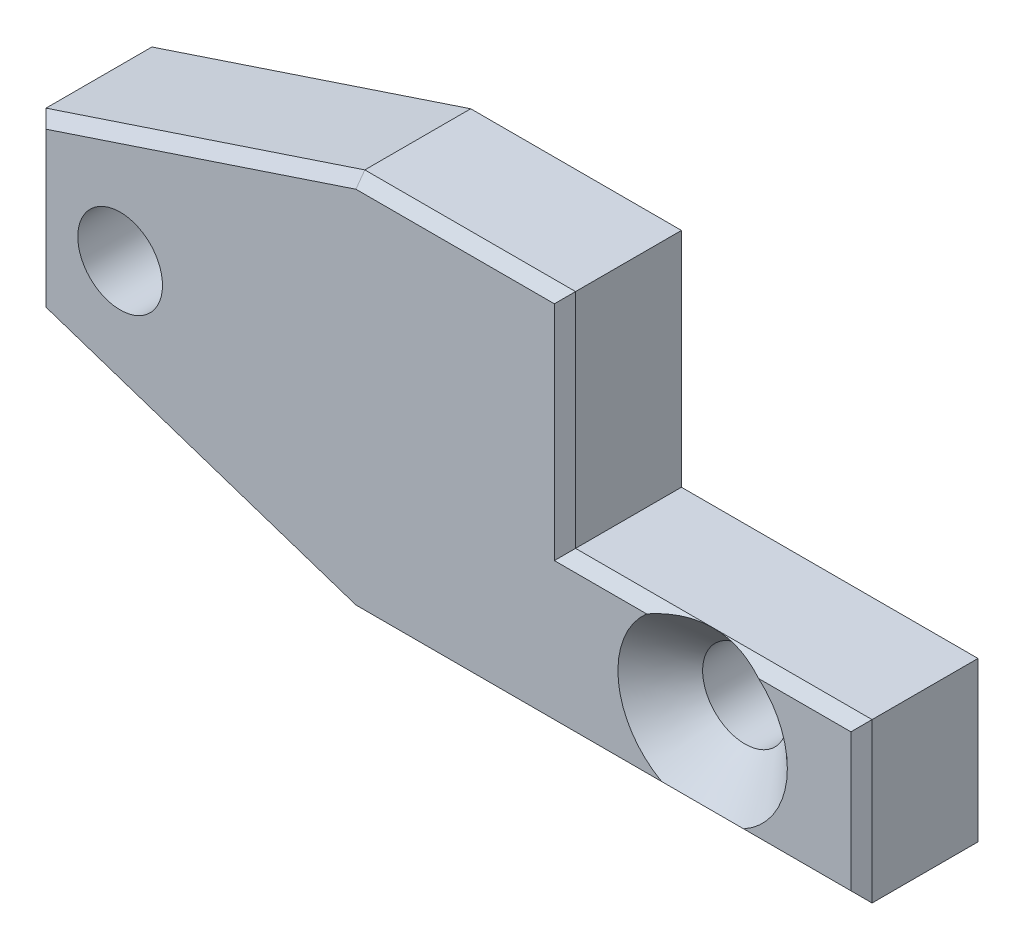
ISO-10303-21;
HEADER;
FILE_DESCRIPTION(('STEP AP214'),'2;1');
FILE_NAME('part.step','',(''),(''),'','','');
FILE_SCHEMA(('AUTOMOTIVE_DESIGN { 1 0 10303 214 1 1 1 1 }'));
ENDSEC;
DATA;
#1=APPLICATION_CONTEXT('core data for automotive mechanical design processes');
#2=APPLICATION_PROTOCOL_DEFINITION('international standard','automotive_design',2000,#1);
#3=PRODUCT_CONTEXT('',#1,'mechanical');
#4=PRODUCT('Part','Part','',(#3));
#5=PRODUCT_RELATED_PRODUCT_CATEGORY('part','',(#4));
#6=PRODUCT_DEFINITION_FORMATION('','',#4);
#7=PRODUCT_DEFINITION_CONTEXT('part definition',#1,'design');
#8=PRODUCT_DEFINITION('design','',#6,#7);
#9=PRODUCT_DEFINITION_SHAPE('','',#8);
#10=(LENGTH_UNIT() NAMED_UNIT(*) SI_UNIT(.MILLI.,.METRE.));
#11=(NAMED_UNIT(*) PLANE_ANGLE_UNIT() SI_UNIT($,.RADIAN.));
#12=(NAMED_UNIT(*) SI_UNIT($,.STERADIAN.) SOLID_ANGLE_UNIT());
#13=UNCERTAINTY_MEASURE_WITH_UNIT(LENGTH_MEASURE(1.E-05),#10,'distance_accuracy_value','');
#14=(GEOMETRIC_REPRESENTATION_CONTEXT(3) GLOBAL_UNCERTAINTY_ASSIGNED_CONTEXT((#13)) GLOBAL_UNIT_ASSIGNED_CONTEXT((#10,
#11,#12)) REPRESENTATION_CONTEXT('',''));
#15=CARTESIAN_POINT('',(0.,0.,0.));
#16=DIRECTION('',(0.,0.,1.));
#17=DIRECTION('',(1.,0.,0.));
#18=AXIS2_PLACEMENT_3D('',#15,#16,#17);
#19=CARTESIAN_POINT('',(0.,0.,5.49999999999999));
#20=DIRECTION('',(0.,-0.707106781186551,-0.707106781186544));
#21=DIRECTION('',(0.,0.707106781186544,-0.707106781186551));
#22=AXIS2_PLACEMENT_3D('',#19,#20,#21);
#23=PLANE('',#22);
#24=DIRECTION('',(-1.,0.,0.));
#25=VECTOR('',#24,1.);
#26=CARTESIAN_POINT('',(-25.,-0.500000000000004,6.));
#27=LINE('',#26,#25);
#28=CARTESIAN_POINT('',(3.8542486889354,-0.500000000000004,6.));
#29=VERTEX_POINT('',#28);
#30=CARTESIAN_POINT('',(-0.500000000000004,-0.500000000000004,6.));
#31=VERTEX_POINT('',#30);
#32=EDGE_CURVE('E267',#29,#31,#27,.T.);
#33=ORIENTED_EDGE('',*,*,#32,.F.);
#34=CARTESIAN_POINT('',(3.8542486889354,-0.500000000000004,6.));
#35=CARTESIAN_POINT('',(4.01258641155454,-0.440132190059061,5.94013219005906));
#36=CARTESIAN_POINT('',(4.17423871776889,-0.384426980618076,5.88442698061807));
#37=CARTESIAN_POINT('',(4.50389329499785,-0.282663844573456,5.78266384457345));
#38=CARTESIAN_POINT('',(4.6719083693802,-0.236626739217406,5.7366267392174));
#39=CARTESIAN_POINT('',(5.01238331410665,-0.15601328637291,5.6560132863729));
#40=CARTESIAN_POINT('',(5.18481341387426,-0.121374877028249,5.62137487702824));
#41=CARTESIAN_POINT('',(5.53361721308568,-0.0645379350736839,5.56453793507368));
#42=CARTESIAN_POINT('',(5.70998746513015,-0.0423289390717648,5.54232893907176));
#43=CARTESIAN_POINT('',(6.05237188354469,-0.0123708478117839,5.51237084781177));
#44=CARTESIAN_POINT('',(6.21822452461401,-0.00370115215090701,5.5037011521509));
#45=CARTESIAN_POINT('',(6.55036088112707,0.00178855513858064,5.49821144486141));
#46=CARTESIAN_POINT('',(6.71664467029121,-0.0013936144390148,5.50139361443901));
#47=CARTESIAN_POINT('',(7.0478905678525,-0.0194818903031596,5.51948189030315));
#48=CARTESIAN_POINT('',(7.21285285999822,-0.0343863370360475,5.53438633703604));
#49=CARTESIAN_POINT('',(7.53994163162591,-0.0753382533007976,5.57533825330079));
#50=CARTESIAN_POINT('',(7.70206865391248,-0.101383565088551,5.60138356508854));
#51=CARTESIAN_POINT('',(7.97376364951053,-0.154250209767276,5.65425020976727));
#52=CARTESIAN_POINT('',(8.0843760808811,-0.178446586628591,5.67844658662858));
#53=CARTESIAN_POINT('',(8.30341082275698,-0.231449845749152,5.73144984574915));
#54=CARTESIAN_POINT('',(8.41183240865257,-0.260258226176412,5.76025822617641));
#55=CARTESIAN_POINT('',(8.62603403044919,-0.322040536484198,5.82204053648419));
#56=CARTESIAN_POINT('',(8.73181845080289,-0.355006911149039,5.85500691114903));
#57=CARTESIAN_POINT('',(8.9407608145694,-0.424742981459738,5.92474298145973));
#58=CARTESIAN_POINT('',(9.0439205907956,-0.461509926933846,5.96150992693384));
#59=CARTESIAN_POINT('',(9.1457513110646,-0.500000000000004,6.));
#60=B_SPLINE_CURVE_WITH_KNOTS('',3,(#34,#35,#36,#37,#38,#39,#40,#41,#42,#43,#44,#45,#46,#47,#48,
#49,#50,#51,#52,#53,#54,#55,#56,#57,#58,#59),.UNSPECIFIED.,.F.,.F.,(4,2,2,2,2,2,2,2,2,2,2,2,4),
(0.,0.538753990696989,1.07865660690679,1.61556903971774,2.15202880367172,2.65011954996967,
3.14830196895251,3.64641387163051,4.144429344479,4.49158740829916,4.83885847298459,
5.18550738739084,5.53190719251239),.UNSPECIFIED.);
#61=CARTESIAN_POINT('',(6.5,0.,5.49999999999999));
#62=VERTEX_POINT('',#61);
#63=EDGE_CURVE('E11',#29,#62,#60,.T.);
#64=ORIENTED_EDGE('',*,*,#63,.T.);
#65=DIRECTION('',(1.,0.,0.));
#66=VECTOR('',#65,1.);
#67=CARTESIAN_POINT('',(0.,0.,5.49999999999999));
#68=LINE('',#67,#66);
#69=CARTESIAN_POINT('',(0.,0.,5.49999999999999));
#70=VERTEX_POINT('',#69);
#71=EDGE_CURVE('E240',#70,#62,#68,.T.);
#72=ORIENTED_EDGE('',*,*,#71,.F.);
#73=DIRECTION('',(-0.577350269189624,-0.577350269189624,0.57735026918963));
#74=VECTOR('',#73,1.);
#75=CARTESIAN_POINT('',(3.49999999999998,3.49999999999998,1.99999999999998));
#76=LINE('',#75,#74);
#77=EDGE_CURVE('E337',#31,#70,#76,.F.);
#78=ORIENTED_EDGE('',*,*,#77,.F.);
#79=EDGE_LOOP('',(#33,#64,#72,#78));
#80=FACE_BOUND('',#79,.T.);
#81=ADVANCED_FACE('F33',(#80),#23,.F.);
#82=CARTESIAN_POINT('',(-25.,10.5,6.));
#83=DIRECTION('',(0.,0.,1.));
#84=DIRECTION('',(1.,0.,0.));
#85=AXIS2_PLACEMENT_3D('',#82,#83,#84);
#86=PLANE('',#85);
#87=CARTESIAN_POINT('',(13.5,-0.500000000000004,6.));
#88=VERTEX_POINT('',#87);
#89=CARTESIAN_POINT('',(9.1457513110646,-0.500000000000004,6.));
#90=VERTEX_POINT('',#89);
#91=EDGE_CURVE('E268',#88,#90,#27,.T.);
#92=ORIENTED_EDGE('',*,*,#91,.T.);
#93=CARTESIAN_POINT('',(6.5,-3.50000000000001,6.));
#94=DIRECTION('',(0.,0.,1.));
#95=DIRECTION('',(1.,0.,0.));
#96=AXIS2_PLACEMENT_3D('',#93,#94,#95);
#97=CIRCLE('',#96,4.00000000000002);
#98=CARTESIAN_POINT('',(8.43649167310376,-7.,6.));
#99=VERTEX_POINT('',#98);
#100=EDGE_CURVE('E279',#90,#99,#97,.F.);
#101=ORIENTED_EDGE('',*,*,#100,.T.);
#102=DIRECTION('',(1.,0.,0.));
#103=VECTOR('',#102,1.);
#104=CARTESIAN_POINT('',(14.,-6.99999999999999,6.));
#105=LINE('',#104,#103);
#106=CARTESIAN_POINT('',(13.5,-6.99999999999999,6.));
#107=VERTEX_POINT('',#106);
#108=EDGE_CURVE('E261',#99,#107,#105,.T.);
#109=ORIENTED_EDGE('',*,*,#108,.T.);
#110=DIRECTION('',(0.,1.,0.));
#111=VECTOR('',#110,1.);
#112=CARTESIAN_POINT('',(13.5,10.5,6.));
#113=LINE('',#112,#111);
#114=EDGE_CURVE('E265',#107,#88,#113,.T.);
#115=ORIENTED_EDGE('',*,*,#114,.T.);
#116=EDGE_LOOP('',(#92,#101,#109,#115));
#117=FACE_BOUND('',#116,.T.);
#118=ADVANCED_FACE('F328',(#117),#86,.T.);
#119=CARTESIAN_POINT('',(0.,10.5,6.));
#120=DIRECTION('',(0.,-1.,0.));
#121=DIRECTION('',(0.,0.,-1.));
#122=AXIS2_PLACEMENT_3D('',#119,#120,#121);
#123=PLANE('',#122);
#124=DIRECTION('',(0.,0.,-1.));
#125=VECTOR('',#124,1.);
#126=CARTESIAN_POINT('',(0.,10.5,6.));
#127=LINE('',#126,#125);
#128=CARTESIAN_POINT('',(0.,10.5,5.5));
#129=VERTEX_POINT('',#128);
#130=CARTESIAN_POINT('',(0.,10.5,0.500000000000009));
#131=VERTEX_POINT('',#130);
#132=EDGE_CURVE('E384',#129,#131,#127,.T.);
#133=ORIENTED_EDGE('',*,*,#132,.T.);
#134=DIRECTION('',(-1.,0.,0.));
#135=VECTOR('',#134,1.);
#136=CARTESIAN_POINT('',(0.,10.5,0.500000000000009));
#137=LINE('',#136,#135);
#138=CARTESIAN_POINT('',(-9.94877148771488,10.5,0.500000000000008));
#139=VERTEX_POINT('',#138);
#140=EDGE_CURVE('E252',#131,#139,#137,.T.);
#141=ORIENTED_EDGE('',*,*,#140,.T.);
#142=DIRECTION('',(0.,0.,-1.));
#143=VECTOR('',#142,1.);
#144=CARTESIAN_POINT('',(-9.94877148771488,10.5,6.));
#145=LINE('',#144,#143);
#146=CARTESIAN_POINT('',(-9.94877148771488,10.5,5.5));
#147=VERTEX_POINT('',#146);
#148=EDGE_CURVE('E189',#147,#139,#145,.T.);
#149=ORIENTED_EDGE('',*,*,#148,.F.);
#150=DIRECTION('',(1.,0.,0.));
#151=VECTOR('',#150,1.);
#152=CARTESIAN_POINT('',(0.,10.5,5.5));
#153=LINE('',#152,#151);
#154=EDGE_CURVE('E250',#147,#129,#153,.T.);
#155=ORIENTED_EDGE('',*,*,#154,.T.);
#156=EDGE_LOOP('',(#133,#141,#149,#155));
#157=FACE_BOUND('',#156,.T.);
#158=ADVANCED_FACE('F332',(#157),#123,.F.);
#159=CARTESIAN_POINT('',(-9.94877148771488,10.5,6.));
#160=DIRECTION('',(0.315258587348597,-0.949005807728787,0.));
#161=DIRECTION('',(0.949005807728787,0.315258587348597,0.));
#162=AXIS2_PLACEMENT_3D('',#159,#160,#161);
#163=PLANE('',#162);
#164=ORIENTED_EDGE('',*,*,#148,.T.);
#165=DIRECTION('',(-0.949005807728787,-0.315258587348597,0.));
#166=VECTOR('',#165,1.);
#167=CARTESIAN_POINT('',(-9.94877148771488,10.5,0.500000000000009));
#168=LINE('',#167,#166);
#169=CARTESIAN_POINT('',(-25.,5.5,0.500000000000009));
#170=VERTEX_POINT('',#169);
#171=EDGE_CURVE('E188',#139,#170,#168,.T.);
#172=ORIENTED_EDGE('',*,*,#171,.T.);
#173=DIRECTION('',(0.,0.,-1.));
#174=VECTOR('',#173,1.);
#175=CARTESIAN_POINT('',(-25.,5.5,6.));
#176=LINE('',#175,#174);
#177=CARTESIAN_POINT('',(-25.,5.5,5.5));
#178=VERTEX_POINT('',#177);
#179=EDGE_CURVE('E171',#178,#170,#176,.T.);
#180=ORIENTED_EDGE('',*,*,#179,.F.);
#181=DIRECTION('',(0.949005807728787,0.315258587348597,0.));
#182=VECTOR('',#181,1.);
#183=CARTESIAN_POINT('',(-9.94877148771488,10.5,5.5));
#184=LINE('',#183,#182);
#185=EDGE_CURVE('E185',#178,#147,#184,.T.);
#186=ORIENTED_EDGE('',*,*,#185,.T.);
#187=EDGE_LOOP('',(#164,#172,#180,#186));
#188=FACE_BOUND('',#187,.T.);
#189=ADVANCED_FACE('F35',(#188),#163,.F.);
#190=CARTESIAN_POINT('',(-25.,5.5,6.));
#191=DIRECTION('',(1.,0.,0.));
#192=DIRECTION('',(0.,0.,-1.));
#193=AXIS2_PLACEMENT_3D('',#190,#191,#192);
#194=PLANE('',#193);
#195=ORIENTED_EDGE('',*,*,#179,.T.);
#196=DIRECTION('',(0.,-1.,0.));
#197=VECTOR('',#196,1.);
#198=CARTESIAN_POINT('',(-25.,5.5,0.500000000000009));
#199=LINE('',#198,#197);
#200=CARTESIAN_POINT('',(-25.,-2.5,0.500000000000009));
#201=VERTEX_POINT('',#200);
#202=EDGE_CURVE('E178',#170,#201,#199,.T.);
#203=ORIENTED_EDGE('',*,*,#202,.T.);
#204=DIRECTION('',(0.,0.,-1.));
#205=VECTOR('',#204,1.);
#206=CARTESIAN_POINT('',(-25.,-2.5,6.));
#207=LINE('',#206,#205);
#208=CARTESIAN_POINT('',(-25.,-2.5,5.5));
#209=VERTEX_POINT('',#208);
#210=EDGE_CURVE('E173',#209,#201,#207,.T.);
#211=ORIENTED_EDGE('',*,*,#210,.F.);
#212=DIRECTION('',(0.,1.,0.));
#213=VECTOR('',#212,1.);
#214=CARTESIAN_POINT('',(-25.,5.5,5.5));
#215=LINE('',#214,#213);
#216=EDGE_CURVE('E168',#209,#178,#215,.T.);
#217=ORIENTED_EDGE('',*,*,#216,.T.);
#218=EDGE_LOOP('',(#195,#203,#211,#217));
#219=FACE_BOUND('',#218,.T.);
#220=ADVANCED_FACE('F170',(#219),#194,.F.);
#221=CARTESIAN_POINT('',(-25.,-2.5,6.));
#222=DIRECTION('',(0.315258587348599,0.949005807728786,0.));
#223=DIRECTION('',(-0.949005807728786,0.315258587348599,0.));
#224=AXIS2_PLACEMENT_3D('',#221,#222,#223);
#225=PLANE('',#224);
#226=ORIENTED_EDGE('',*,*,#210,.T.);
#227=DIRECTION('',(0.949005807728786,-0.315258587348599,0.));
#228=VECTOR('',#227,1.);
#229=CARTESIAN_POINT('',(-25.,-2.5,0.500000000000009));
#230=LINE('',#229,#228);
#231=CARTESIAN_POINT('',(-9.94877148771488,-7.50000000000003,0.500000000000009));
#232=VERTEX_POINT('',#231);
#233=EDGE_CURVE('E229',#201,#232,#230,.T.);
#234=ORIENTED_EDGE('',*,*,#233,.T.);
#235=DIRECTION('',(0.,0.,-1.));
#236=VECTOR('',#235,1.);
#237=CARTESIAN_POINT('',(-9.94877148771488,-7.50000000000003,6.));
#238=LINE('',#237,#236);
#239=CARTESIAN_POINT('',(-9.94877148771488,-7.50000000000003,5.5));
#240=VERTEX_POINT('',#239);
#241=EDGE_CURVE('E396',#240,#232,#238,.T.);
#242=ORIENTED_EDGE('',*,*,#241,.F.);
#243=DIRECTION('',(-0.949005807728786,0.315258587348599,0.));
#244=VECTOR('',#243,1.);
#245=CARTESIAN_POINT('',(-25.,-2.5,5.5));
#246=LINE('',#245,#244);
#247=EDGE_CURVE('E227',#240,#209,#246,.T.);
#248=ORIENTED_EDGE('',*,*,#247,.T.);
#249=EDGE_LOOP('',(#226,#234,#242,#248));
#250=FACE_BOUND('',#249,.T.);
#251=ADVANCED_FACE('F401',(#250),#225,.F.);
#252=CARTESIAN_POINT('',(-9.94877148771488,-7.50000000000003,6.));
#253=DIRECTION('',(0.,1.,0.));
#254=DIRECTION('',(-1.,0.,0.));
#255=AXIS2_PLACEMENT_3D('',#252,#253,#254);
#256=PLANE('',#255);
#257=ORIENTED_EDGE('',*,*,#241,.T.);
#258=DIRECTION('',(1.,0.,0.));
#259=VECTOR('',#258,1.);
#260=CARTESIAN_POINT('',(-9.94877148771488,-7.50000000000003,0.500000000000009));
#261=LINE('',#260,#259);
#262=CARTESIAN_POINT('',(14.,-7.5,0.500000000000004));
#263=VERTEX_POINT('',#262);
#264=EDGE_CURVE('E233',#232,#263,#261,.T.);
#265=ORIENTED_EDGE('',*,*,#264,.T.);
#266=DIRECTION('',(0.,0.,-1.));
#267=VECTOR('',#266,1.);
#268=CARTESIAN_POINT('',(14.,-7.5,6.));
#269=LINE('',#268,#267);
#270=CARTESIAN_POINT('',(14.,-7.5,5.5));
#271=VERTEX_POINT('',#270);
#272=EDGE_CURVE('E393',#271,#263,#269,.T.);
#273=ORIENTED_EDGE('',*,*,#272,.F.);
#274=DIRECTION('',(-1.,0.,0.));
#275=VECTOR('',#274,1.);
#276=CARTESIAN_POINT('',(-9.94877148771488,-7.50000000000003,5.5));
#277=LINE('',#276,#275);
#278=EDGE_CURVE('E231',#271,#240,#277,.T.);
#279=ORIENTED_EDGE('',*,*,#278,.T.);
#280=EDGE_LOOP('',(#257,#265,#273,#279));
#281=FACE_BOUND('',#280,.T.);
#282=ADVANCED_FACE('F446',(#281),#256,.F.);
#283=CARTESIAN_POINT('',(14.,0.,6.));
#284=DIRECTION('',(1.,0.,0.));
#285=DIRECTION('',(0.,1.,0.));
#286=AXIS2_PLACEMENT_3D('',#283,#284,#285);
#287=PLANE('',#286);
#288=ORIENTED_EDGE('',*,*,#272,.T.);
#289=DIRECTION('',(0.,1.,0.));
#290=VECTOR('',#289,1.);
#291=CARTESIAN_POINT('',(14.,0.,0.500000000000004));
#292=LINE('',#291,#290);
#293=CARTESIAN_POINT('',(14.,0.,0.500000000000004));
#294=VERTEX_POINT('',#293);
#295=EDGE_CURVE('E237',#263,#294,#292,.T.);
#296=ORIENTED_EDGE('',*,*,#295,.T.);
#297=DIRECTION('',(0.,0.,-1.));
#298=VECTOR('',#297,1.);
#299=CARTESIAN_POINT('',(14.,0.,6.));
#300=LINE('',#299,#298);
#301=CARTESIAN_POINT('',(14.,0.,5.49999999999999));
#302=VERTEX_POINT('',#301);
#303=EDGE_CURVE('E390',#302,#294,#300,.T.);
#304=ORIENTED_EDGE('',*,*,#303,.F.);
#305=DIRECTION('',(0.,-1.,0.));
#306=VECTOR('',#305,1.);
#307=CARTESIAN_POINT('',(14.,0.,5.49999999999999));
#308=LINE('',#307,#306);
#309=EDGE_CURVE('E235',#302,#271,#308,.T.);
#310=ORIENTED_EDGE('',*,*,#309,.T.);
#311=EDGE_LOOP('',(#288,#296,#304,#310));
#312=FACE_BOUND('',#311,.T.);
#313=ADVANCED_FACE('F449',(#312),#287,.T.);
#314=CARTESIAN_POINT('',(0.,0.,6.));
#315=DIRECTION('',(0.,1.,0.));
#316=DIRECTION('',(0.,0.,1.));
#317=AXIS2_PLACEMENT_3D('',#314,#315,#316);
#318=PLANE('',#317);
#319=ORIENTED_EDGE('',*,*,#303,.T.);
#320=DIRECTION('',(-1.,0.,0.));
#321=VECTOR('',#320,1.);
#322=CARTESIAN_POINT('',(0.,0.,0.500000000000004));
#323=LINE('',#322,#321);
#324=CARTESIAN_POINT('',(0.,0.,0.500000000000004));
#325=VERTEX_POINT('',#324);
#326=EDGE_CURVE('E243',#294,#325,#323,.T.);
#327=ORIENTED_EDGE('',*,*,#326,.T.);
#328=DIRECTION('',(0.,0.,-1.));
#329=VECTOR('',#328,1.);
#330=CARTESIAN_POINT('',(0.,0.,6.));
#331=LINE('',#330,#329);
#332=EDGE_CURVE('E387',#70,#325,#331,.T.);
#333=ORIENTED_EDGE('',*,*,#332,.F.);
#334=ORIENTED_EDGE('',*,*,#71,.T.);
#335=EDGE_CURVE('E239',#62,#302,#68,.T.);
#336=ORIENTED_EDGE('',*,*,#335,.T.);
#337=EDGE_LOOP('',(#319,#327,#333,#334,#336));
#338=FACE_BOUND('',#337,.T.);
#339=ADVANCED_FACE('F452',(#338),#318,.T.);
#340=CARTESIAN_POINT('',(0.,10.5,6.));
#341=DIRECTION('',(1.,0.,0.));
#342=DIRECTION('',(0.,1.,0.));
#343=AXIS2_PLACEMENT_3D('',#340,#341,#342);
#344=PLANE('',#343);
#345=ORIENTED_EDGE('',*,*,#332,.T.);
#346=DIRECTION('',(0.,1.,0.));
#347=VECTOR('',#346,1.);
#348=CARTESIAN_POINT('',(0.,10.5,0.500000000000004));
#349=LINE('',#348,#347);
#350=EDGE_CURVE('E248',#325,#131,#349,.T.);
#351=ORIENTED_EDGE('',*,*,#350,.T.);
#352=ORIENTED_EDGE('',*,*,#132,.F.);
#353=DIRECTION('',(0.,-1.,0.));
#354=VECTOR('',#353,1.);
#355=CARTESIAN_POINT('',(0.,10.5,5.49999999999999));
#356=LINE('',#355,#354);
#357=EDGE_CURVE('E245',#129,#70,#356,.T.);
#358=ORIENTED_EDGE('',*,*,#357,.T.);
#359=EDGE_LOOP('',(#345,#351,#352,#358));
#360=FACE_BOUND('',#359,.T.);
#361=ADVANCED_FACE('F457',(#360),#344,.T.);
#362=CARTESIAN_POINT('',(-21.,1.49999999999997,6.));
#363=DIRECTION('',(0.,0.,1.));
#364=DIRECTION('',(1.,0.,0.));
#365=AXIS2_PLACEMENT_3D('',#362,#363,#364);
#366=CIRCLE('',#365,2.);
#367=CARTESIAN_POINT('',(-19.,1.49999999999997,6.));
#368=VERTEX_POINT('',#367);
#369=EDGE_CURVE('E462',#368,#368,#366,.T.);
#370=ORIENTED_EDGE('',*,*,#369,.F.);
#371=EDGE_LOOP('',(#370));
#372=FACE_BOUND('',#371,.T.);
#373=CARTESIAN_POINT('',(-9.86789471810794,-7.00000000000002,6.));
#374=VERTEX_POINT('',#373);
#375=CARTESIAN_POINT('',(4.56350832689624,-7.,6.));
#376=VERTEX_POINT('',#375);
#377=EDGE_CURVE('E262',#374,#376,#105,.T.);
#378=ORIENTED_EDGE('',*,*,#377,.T.);
#379=CARTESIAN_POINT('',(6.5,-3.50000000000001,6.));
#380=DIRECTION('',(0.,0.,1.));
#381=DIRECTION('',(1.,0.,0.));
#382=AXIS2_PLACEMENT_3D('',#379,#380,#381);
#383=CIRCLE('',#382,4.00000000000002);
#384=EDGE_CURVE('E277',#376,#29,#383,.F.);
#385=ORIENTED_EDGE('',*,*,#384,.T.);
#386=ORIENTED_EDGE('',*,*,#32,.T.);
#387=DIRECTION('',(0.,1.,0.));
#388=VECTOR('',#387,1.);
#389=CARTESIAN_POINT('',(-0.500000000000004,10.5,6.));
#390=LINE('',#389,#388);
#391=CARTESIAN_POINT('',(-0.500000000000004,9.99999999999999,6.));
#392=VERTEX_POINT('',#391);
#393=EDGE_CURVE('E271',#31,#392,#390,.T.);
#394=ORIENTED_EDGE('',*,*,#393,.T.);
#395=DIRECTION('',(-1.,0.,0.));
#396=VECTOR('',#395,1.);
#397=CARTESIAN_POINT('',(-9.94877148771488,9.99999999999999,6.));
#398=LINE('',#397,#396);
#399=CARTESIAN_POINT('',(-9.86789471810792,9.99999999999999,6.));
#400=VERTEX_POINT('',#399);
#401=EDGE_CURVE('E254',#392,#400,#398,.T.);
#402=ORIENTED_EDGE('',*,*,#401,.T.);
#403=DIRECTION('',(-0.949005807728787,-0.315258587348597,0.));
#404=VECTOR('',#403,1.);
#405=CARTESIAN_POINT('',(-24.8423707063257,5.0254970961356,6.));
#406=LINE('',#405,#404);
#407=CARTESIAN_POINT('',(-24.5,5.13923223278782,6.));
#408=VERTEX_POINT('',#407);
#409=EDGE_CURVE('E256',#400,#408,#406,.T.);
#410=ORIENTED_EDGE('',*,*,#409,.T.);
#411=DIRECTION('',(0.,-1.,0.));
#412=VECTOR('',#411,1.);
#413=CARTESIAN_POINT('',(-24.5,-2.5,6.));
#414=LINE('',#413,#412);
#415=CARTESIAN_POINT('',(-24.5,-2.13923223278782,6.));
#416=VERTEX_POINT('',#415);
#417=EDGE_CURVE('E195',#408,#416,#414,.T.);
#418=ORIENTED_EDGE('',*,*,#417,.T.);
#419=DIRECTION('',(0.949005807728786,-0.315258587348599,0.));
#420=VECTOR('',#419,1.);
#421=CARTESIAN_POINT('',(-9.79114219404058,-7.02549709613563,6.));
#422=LINE('',#421,#420);
#423=EDGE_CURVE('E259',#416,#374,#422,.T.);
#424=ORIENTED_EDGE('',*,*,#423,.T.);
#425=EDGE_LOOP('',(#378,#385,#386,#394,#402,#410,#418,#424));
#426=FACE_BOUND('',#425,.T.);
#427=ADVANCED_FACE('F335',(#372,#426),#86,.T.);
#428=CARTESIAN_POINT('',(-25.,10.5,0.));
#429=DIRECTION('',(0.,0.,1.));
#430=DIRECTION('',(1.,0.,0.));
#431=AXIS2_PLACEMENT_3D('',#428,#429,#430);
#432=PLANE('',#431);
#433=CARTESIAN_POINT('',(6.5,-3.50000000000001,0.));
#434=DIRECTION('',(0.,0.,1.));
#435=DIRECTION('',(1.,0.,0.));
#436=AXIS2_PLACEMENT_3D('',#433,#434,#435);
#437=CIRCLE('',#436,2.);
#438=CARTESIAN_POINT('',(8.5,-3.50000000000001,0.));
#439=VERTEX_POINT('',#438);
#440=EDGE_CURVE('E467',#439,#439,#437,.T.);
#441=ORIENTED_EDGE('',*,*,#440,.T.);
#442=EDGE_LOOP('',(#441));
#443=FACE_BOUND('',#442,.T.);
#444=CARTESIAN_POINT('',(-21.,1.49999999999997,0.));
#445=DIRECTION('',(0.,0.,1.));
#446=DIRECTION('',(1.,0.,0.));
#447=AXIS2_PLACEMENT_3D('',#444,#445,#446);
#448=CIRCLE('',#447,2.);
#449=CARTESIAN_POINT('',(-19.,1.49999999999997,0.));
#450=VERTEX_POINT('',#449);
#451=EDGE_CURVE('E460',#450,#450,#448,.T.);
#452=ORIENTED_EDGE('',*,*,#451,.T.);
#453=EDGE_LOOP('',(#452));
#454=FACE_BOUND('',#453,.T.);
#455=DIRECTION('',(0.,1.,0.));
#456=VECTOR('',#455,1.);
#457=CARTESIAN_POINT('',(-24.5,10.5,0.));
#458=LINE('',#457,#456);
#459=CARTESIAN_POINT('',(-24.5,-2.13923223278783,0.));
#460=VERTEX_POINT('',#459);
#461=CARTESIAN_POINT('',(-24.5,5.13923223278783,0.));
#462=VERTEX_POINT('',#461);
#463=EDGE_CURVE('E222',#460,#462,#458,.T.);
#464=ORIENTED_EDGE('',*,*,#463,.T.);
#465=DIRECTION('',(0.949005807728787,0.315258587348597,0.));
#466=VECTOR('',#465,1.);
#467=CARTESIAN_POINT('',(-23.3464595546747,5.52243698062077,0.));
#468=LINE('',#467,#466);
#469=CARTESIAN_POINT('',(-9.86789471810792,10.,0.));
#470=VERTEX_POINT('',#469);
#471=EDGE_CURVE('E179',#462,#470,#468,.T.);
#472=ORIENTED_EDGE('',*,*,#471,.T.);
#473=DIRECTION('',(1.,0.,0.));
#474=VECTOR('',#473,1.);
#475=CARTESIAN_POINT('',(-25.,10.,0.));
#476=LINE('',#475,#474);
#477=CARTESIAN_POINT('',(-0.500000000000007,10.,0.));
#478=VERTEX_POINT('',#477);
#479=EDGE_CURVE('E207',#470,#478,#476,.T.);
#480=ORIENTED_EDGE('',*,*,#479,.T.);
#481=DIRECTION('',(0.,-1.,0.));
#482=VECTOR('',#481,1.);
#483=CARTESIAN_POINT('',(-0.500000000000007,0.,0.));
#484=LINE('',#483,#482);
#485=CARTESIAN_POINT('',(-0.500000000000007,-0.500000000000009,0.));
#486=VERTEX_POINT('',#485);
#487=EDGE_CURVE('E212',#478,#486,#484,.T.);
#488=ORIENTED_EDGE('',*,*,#487,.T.);
#489=DIRECTION('',(1.,0.,0.));
#490=VECTOR('',#489,1.);
#491=CARTESIAN_POINT('',(14.,-0.500000000000009,0.));
#492=LINE('',#491,#490);
#493=CARTESIAN_POINT('',(13.5,-0.500000000000009,0.));
#494=VERTEX_POINT('',#493);
#495=EDGE_CURVE('E214',#486,#494,#492,.T.);
#496=ORIENTED_EDGE('',*,*,#495,.T.);
#497=DIRECTION('',(0.,-1.,0.));
#498=VECTOR('',#497,1.);
#499=CARTESIAN_POINT('',(13.5,-7.5,0.));
#500=LINE('',#499,#498);
#501=CARTESIAN_POINT('',(13.5,-7.,0.));
#502=VERTEX_POINT('',#501);
#503=EDGE_CURVE('E216',#494,#502,#500,.T.);
#504=ORIENTED_EDGE('',*,*,#503,.T.);
#505=DIRECTION('',(-1.,0.,0.));
#506=VECTOR('',#505,1.);
#507=CARTESIAN_POINT('',(-25.,-7.00000000000005,0.));
#508=LINE('',#507,#506);
#509=CARTESIAN_POINT('',(-9.86789471810794,-7.00000000000003,0.));
#510=VERTEX_POINT('',#509);
#511=EDGE_CURVE('E218',#502,#510,#508,.T.);
#512=ORIENTED_EDGE('',*,*,#511,.T.);
#513=DIRECTION('',(-0.949005807728786,0.315258587348599,0.));
#514=VECTOR('',#513,1.);
#515=CARTESIAN_POINT('',(-28.7317397006182,-0.733453396474163,0.));
#516=LINE('',#515,#514);
#517=EDGE_CURVE('E220',#510,#460,#516,.T.);
#518=ORIENTED_EDGE('',*,*,#517,.T.);
#519=EDGE_LOOP('',(#464,#472,#480,#488,#496,#504,#512,#518));
#520=FACE_BOUND('',#519,.T.);
#521=ADVANCED_FACE('F416',(#443,#454,#520),#432,.F.);
#522=CARTESIAN_POINT('',(13.5,10.5,0.));
#523=DIRECTION('',(0.707106781186542,0.,-0.707106781186553));
#524=DIRECTION('',(-0.707106781186553,0.,-0.707106781186542));
#525=AXIS2_PLACEMENT_3D('',#522,#523,#524);
#526=PLANE('',#525);
#527=DIRECTION('',(0.577350269189635,-0.577350269189616,0.577350269189626));
#528=VECTOR('',#527,1.);
#529=CARTESIAN_POINT('',(7.66666666666666,-1.16666666666687,-5.83333333333324));
#530=LINE('',#529,#528);
#531=EDGE_CURVE('E378',#502,#263,#530,.T.);
#532=ORIENTED_EDGE('',*,*,#531,.F.);
#533=ORIENTED_EDGE('',*,*,#503,.F.);
#534=DIRECTION('',(-0.57735026918963,-0.577350269189627,-0.577350269189621));
#535=VECTOR('',#534,1.);
#536=CARTESIAN_POINT('',(0.666666666666482,-13.3333333333334,-12.8333333333333));
#537=LINE('',#536,#535);
#538=EDGE_CURVE('E381',#294,#494,#537,.T.);
#539=ORIENTED_EDGE('',*,*,#538,.F.);
#540=ORIENTED_EDGE('',*,*,#295,.F.);
#541=EDGE_LOOP('',(#532,#533,#539,#540));
#542=FACE_BOUND('',#541,.T.);
#543=ADVANCED_FACE('F438',(#542),#526,.T.);
#544=CARTESIAN_POINT('',(-25.,-0.500000000000009,0.));
#545=DIRECTION('',(0.,0.707106781186544,-0.707106781186551));
#546=DIRECTION('',(0.,0.707106781186551,0.707106781186544));
#547=AXIS2_PLACEMENT_3D('',#544,#545,#546);
#548=PLANE('',#547);
#549=ORIENTED_EDGE('',*,*,#538,.T.);
#550=ORIENTED_EDGE('',*,*,#495,.F.);
#551=DIRECTION('',(-0.577350269189626,-0.577350269189628,-0.577350269189623));
#552=VECTOR('',#551,1.);
#553=CARTESIAN_POINT('',(-8.66666666666669,-8.66666666666672,-8.16666666666663));
#554=LINE('',#553,#552);
#555=EDGE_CURVE('E375',#325,#486,#554,.T.);
#556=ORIENTED_EDGE('',*,*,#555,.F.);
#557=ORIENTED_EDGE('',*,*,#326,.F.);
#558=EDGE_LOOP('',(#549,#550,#556,#557));
#559=FACE_BOUND('',#558,.T.);
#560=ADVANCED_FACE('F433',(#559),#548,.T.);
#561=CARTESIAN_POINT('',(-9.94877148771488,-7.50000000000003,0.500000000000009));
#562=DIRECTION('',(0.,0.707106781186553,0.707106781186542));
#563=DIRECTION('',(0.,-0.707106781186542,0.707106781186553));
#564=AXIS2_PLACEMENT_3D('',#561,#562,#563);
#565=PLANE('',#564);
#566=ORIENTED_EDGE('',*,*,#531,.T.);
#567=ORIENTED_EDGE('',*,*,#264,.F.);
#568=DIRECTION('',(0.113636139784541,0.702526450653231,-0.702526450653242));
#569=VECTOR('',#568,1.);
#570=CARTESIAN_POINT('',(-9.94877148771488,-7.50000000000003,0.500000000000009));
#571=LINE('',#570,#569);
#572=EDGE_CURVE('E372',#510,#232,#571,.F.);
#573=ORIENTED_EDGE('',*,*,#572,.F.);
#574=ORIENTED_EDGE('',*,*,#511,.F.);
#575=EDGE_LOOP('',(#566,#567,#573,#574));
#576=FACE_BOUND('',#575,.T.);
#577=ADVANCED_FACE('F443',(#576),#565,.F.);
#578=CARTESIAN_POINT('',(-0.500000000000007,10.5,0.));
#579=DIRECTION('',(0.707106781186545,0.,-0.70710678118655));
#580=DIRECTION('',(-0.70710678118655,0.,-0.707106781186545));
#581=AXIS2_PLACEMENT_3D('',#578,#579,#580);
#582=PLANE('',#581);
#583=ORIENTED_EDGE('',*,*,#555,.T.);
#584=ORIENTED_EDGE('',*,*,#487,.F.);
#585=DIRECTION('',(0.57735026918963,0.57735026918962,0.577350269189626));
#586=VECTOR('',#585,1.);
#587=CARTESIAN_POINT('',(0.,10.5,0.500000000000007));
#588=LINE('',#587,#586);
#589=EDGE_CURVE('E369',#131,#478,#588,.F.);
#590=ORIENTED_EDGE('',*,*,#589,.F.);
#591=ORIENTED_EDGE('',*,*,#350,.F.);
#592=EDGE_LOOP('',(#583,#584,#590,#591));
#593=FACE_BOUND('',#592,.T.);
#594=ADVANCED_FACE('F428',(#593),#582,.T.);
#595=CARTESIAN_POINT('',(-25.,-2.5,0.500000000000009));
#596=DIRECTION('',(0.222921484941488,0.671048442030448,0.707106781186541));
#597=DIRECTION('',(0.,-0.725359434060685,0.688370315614468));
#598=AXIS2_PLACEMENT_3D('',#595,#596,#597);
#599=PLANE('',#598);
#600=ORIENTED_EDGE('',*,*,#572,.T.);
#601=ORIENTED_EDGE('',*,*,#233,.F.);
#602=DIRECTION('',(0.629864118626425,0.454469343447834,-0.629864118626432));
#603=VECTOR('',#602,1.);
#604=CARTESIAN_POINT('',(-25.,-2.5,0.500000000000009));
#605=LINE('',#604,#603);
#606=EDGE_CURVE('E366',#460,#201,#605,.F.);
#607=ORIENTED_EDGE('',*,*,#606,.F.);
#608=ORIENTED_EDGE('',*,*,#517,.F.);
#609=EDGE_LOOP('',(#600,#601,#607,#608));
#610=FACE_BOUND('',#609,.T.);
#611=ADVANCED_FACE('F406',(#610),#599,.F.);
#612=CARTESIAN_POINT('',(0.,10.5,0.500000000000009));
#613=DIRECTION('',(0.,-0.707106781186551,0.707106781186544));
#614=DIRECTION('',(0.,-0.707106781186544,-0.707106781186551));
#615=AXIS2_PLACEMENT_3D('',#612,#613,#614);
#616=PLANE('',#615);
#617=ORIENTED_EDGE('',*,*,#589,.T.);
#618=ORIENTED_EDGE('',*,*,#479,.F.);
#619=DIRECTION('',(-0.113636139784543,0.702526450653233,0.70252645065324));
#620=VECTOR('',#619,1.);
#621=CARTESIAN_POINT('',(-9.82030128766758,9.70576575528646,-0.294234244713537));
#622=LINE('',#621,#620);
#623=EDGE_CURVE('E364',#139,#470,#622,.F.);
#624=ORIENTED_EDGE('',*,*,#623,.F.);
#625=ORIENTED_EDGE('',*,*,#140,.F.);
#626=EDGE_LOOP('',(#617,#618,#624,#625));
#627=FACE_BOUND('',#626,.T.);
#628=ADVANCED_FACE('F423',(#627),#616,.F.);
#629=CARTESIAN_POINT('',(-25.,5.5,0.500000000000009));
#630=DIRECTION('',(0.707106781186551,0.,0.707106781186544));
#631=DIRECTION('',(0.707106781186544,0.,-0.707106781186551));
#632=AXIS2_PLACEMENT_3D('',#629,#630,#631);
#633=PLANE('',#632);
#634=ORIENTED_EDGE('',*,*,#606,.T.);
#635=ORIENTED_EDGE('',*,*,#202,.F.);
#636=DIRECTION('',(0.629864118626423,-0.454469343447838,-0.62986411862643));
#637=VECTOR('',#636,1.);
#638=CARTESIAN_POINT('',(-25.,5.50000000000001,0.500000000000009));
#639=LINE('',#638,#637);
#640=EDGE_CURVE('E362',#462,#170,#639,.F.);
#641=ORIENTED_EDGE('',*,*,#640,.F.);
#642=ORIENTED_EDGE('',*,*,#463,.F.);
#643=EDGE_LOOP('',(#634,#635,#641,#642));
#644=FACE_BOUND('',#643,.T.);
#645=ADVANCED_FACE('F412',(#644),#633,.F.);
#646=CARTESIAN_POINT('',(-9.94877148771488,10.5,0.500000000000009));
#647=DIRECTION('',(0.222921484941486,-0.671048442030446,0.707106781186543));
#648=DIRECTION('',(0.,-0.725359434060687,-0.688370315614466));
#649=AXIS2_PLACEMENT_3D('',#646,#647,#648);
#650=PLANE('',#649);
#651=ORIENTED_EDGE('',*,*,#623,.T.);
#652=ORIENTED_EDGE('',*,*,#471,.F.);
#653=ORIENTED_EDGE('',*,*,#640,.T.);
#654=ORIENTED_EDGE('',*,*,#171,.F.);
#655=EDGE_LOOP('',(#651,#652,#653,#654));
#656=FACE_BOUND('',#655,.T.);
#657=ADVANCED_FACE('F418',(#656),#650,.F.);
#658=CARTESIAN_POINT('',(-28.7317397006182,-0.733453396474156,6.));
#659=DIRECTION('',(-0.222921484941485,-0.67104844203044,0.707106781186549));
#660=DIRECTION('',(0.,-0.725359434060693,-0.68837031561446));
#661=AXIS2_PLACEMENT_3D('',#658,#659,#660);
#662=PLANE('',#661);
#663=DIRECTION('',(0.113636139784539,0.702526450653239,0.702526450653234));
#664=VECTOR('',#663,1.);
#665=CARTESIAN_POINT('',(-9.61121338079883,-5.4131331001687,7.58686689983131));
#666=LINE('',#665,#664);
#667=EDGE_CURVE('E198',#374,#240,#666,.F.);
#668=ORIENTED_EDGE('',*,*,#667,.F.);
#669=ORIENTED_EDGE('',*,*,#423,.F.);
#670=DIRECTION('',(0.629864118626428,0.45446934344784,0.629864118626424));
#671=VECTOR('',#670,1.);
#672=CARTESIAN_POINT('',(-20.8819700701714,0.471304926194344,9.61802992982859));
#673=LINE('',#672,#671);
#674=EDGE_CURVE('E360',#209,#416,#673,.T.);
#675=ORIENTED_EDGE('',*,*,#674,.F.);
#676=ORIENTED_EDGE('',*,*,#247,.F.);
#677=EDGE_LOOP('',(#668,#669,#675,#676));
#678=FACE_BOUND('',#677,.T.);
#679=ADVANCED_FACE('F484',(#678),#662,.T.);
#680=CARTESIAN_POINT('',(-24.5,10.5,6.));
#681=DIRECTION('',(-0.707106781186545,0.,0.70710678118655));
#682=DIRECTION('',(0.70710678118655,0.,0.707106781186545));
#683=AXIS2_PLACEMENT_3D('',#680,#681,#682);
#684=PLANE('',#683);
#685=ORIENTED_EDGE('',*,*,#674,.T.);
#686=ORIENTED_EDGE('',*,*,#417,.F.);
#687=DIRECTION('',(0.629864118626426,-0.454469343447845,0.629864118626422));
#688=VECTOR('',#687,1.);
#689=CARTESIAN_POINT('',(-24.1520511402256,4.88817476629815,6.3479488597744));
#690=LINE('',#689,#688);
#691=EDGE_CURVE('E193',#178,#408,#690,.T.);
#692=ORIENTED_EDGE('',*,*,#691,.F.);
#693=ORIENTED_EDGE('',*,*,#216,.F.);
#694=EDGE_LOOP('',(#685,#686,#692,#693));
#695=FACE_BOUND('',#694,.T.);
#696=ADVANCED_FACE('F194',(#695),#684,.T.);
#697=CARTESIAN_POINT('',(-25.,-7.00000000000004,6.));
#698=DIRECTION('',(0.,-0.707106781186545,0.70710678118655));
#699=DIRECTION('',(0.,-0.70710678118655,-0.707106781186545));
#700=AXIS2_PLACEMENT_3D('',#697,#698,#699);
#701=PLANE('',#700);
#702=ORIENTED_EDGE('',*,*,#108,.F.);
#703=CARTESIAN_POINT('',(8.43649167310376,-7.,6.));
#704=CARTESIAN_POINT('',(8.35777734897735,-7.0203243253104,5.97967567468959));
#705=CARTESIAN_POINT('',(8.27850354590508,-7.0395526926267,5.9604473073733));
#706=CARTESIAN_POINT('',(8.11889681583578,-7.07570300014025,5.92429699985975));
#707=CARTESIAN_POINT('',(8.0385637070156,-7.09262453858124,5.90737546141876));
#708=CARTESIAN_POINT('',(7.79599796273503,-7.13976813155013,5.86023186844987));
#709=CARTESIAN_POINT('',(7.63230492984141,-7.16634152060787,5.83365847939213));
#710=CARTESIAN_POINT('',(7.30741622093965,-7.2082421042779,5.7917578957221));
#711=CARTESIAN_POINT('',(7.14630527614193,-7.22389837544296,5.77610162455704));
#712=CARTESIAN_POINT('',(6.82280754176957,-7.24479563668207,5.75520436331793));
#713=CARTESIAN_POINT('',(6.66042148043649,-7.2500421912235,5.74995780877651));
#714=CARTESIAN_POINT('',(6.33597133269398,-7.24995737833401,5.750042621666));
#715=CARTESIAN_POINT('',(6.17390723469475,-7.2446465767275,5.7553534232725));
#716=CARTESIAN_POINT('',(5.85105672080421,-7.22366358090468,5.77633641909532));
#717=CARTESIAN_POINT('',(5.69027102833142,-7.20798589147554,5.79201410852447));
#718=CARTESIAN_POINT('',(5.36604807146738,-7.16608514991615,5.83391485008385));
#719=CARTESIAN_POINT('',(5.20269519437869,-7.13953503902574,5.86046496097427));
#720=CARTESIAN_POINT('',(4.96062872063177,-7.09245702958217,5.90754297041784));
#721=CARTESIAN_POINT('',(4.8804600444296,-7.07556242042153,5.92443757957847));
#722=CARTESIAN_POINT('',(4.72117806119775,-7.0394754607726,5.9605245392274));
#723=CARTESIAN_POINT('',(4.6420645741292,-7.02028350798397,5.97971649201603));
#724=CARTESIAN_POINT('',(4.56350832689624,-7.,6.));
#725=B_SPLINE_CURVE_WITH_KNOTS('',3,(#703,#704,#705,#706,#707,#708,#709,#710,#711,#712,#713,
#714,#715,#716,#717,#718,#719,#720,#721,#722,#723,#724),.UNSPECIFIED.,.F.,.F.,(4,2,2,2,2,2,2,2,
2,2,4),(0.,0.251362424421718,0.502768570233518,1.00591879260502,1.49315726900428,
1.98013522401464,2.46616547119188,2.95245355688399,3.45459164990474,3.7054927731187,
3.95635052477233),.UNSPECIFIED.);
#726=EDGE_CURVE('E59',#99,#376,#725,.T.);
#727=ORIENTED_EDGE('',*,*,#726,.T.);
#728=ORIENTED_EDGE('',*,*,#377,.F.);
#729=ORIENTED_EDGE('',*,*,#667,.T.);
#730=ORIENTED_EDGE('',*,*,#278,.F.);
#731=DIRECTION('',(0.577350269189626,-0.577350269189628,-0.577350269189624));
#732=VECTOR('',#731,1.);
#733=CARTESIAN_POINT('',(0.666666666666666,5.83333333333336,18.8333333333333));
#734=LINE('',#733,#732);
#735=EDGE_CURVE('E199',#107,#271,#734,.T.);
#736=ORIENTED_EDGE('',*,*,#735,.F.);
#737=EDGE_LOOP('',(#702,#727,#728,#729,#730,#736));
#738=FACE_BOUND('',#737,.T.);
#739=ADVANCED_FACE('F288',(#738),#701,.T.);
#740=CARTESIAN_POINT('',(-23.3464595546747,5.52243698062077,6.));
#741=DIRECTION('',(-0.222921484941483,0.671048442030438,0.707106781186552));
#742=DIRECTION('',(0.,-0.725359434060695,0.688370315614458));
#743=AXIS2_PLACEMENT_3D('',#740,#741,#742);
#744=PLANE('',#743);
#745=ORIENTED_EDGE('',*,*,#691,.T.);
#746=ORIENTED_EDGE('',*,*,#409,.F.);
#747=DIRECTION('',(0.113636139784552,-0.702526450653239,0.702526450653232));
#748=VECTOR('',#747,1.);
#749=CARTESIAN_POINT('',(-10.0632982003471,11.2080321901384,4.79196780986164));
#750=LINE('',#749,#748);
#751=EDGE_CURVE('E204',#147,#400,#750,.T.);
#752=ORIENTED_EDGE('',*,*,#751,.F.);
#753=ORIENTED_EDGE('',*,*,#185,.F.);
#754=EDGE_LOOP('',(#745,#746,#752,#753));
#755=FACE_BOUND('',#754,.T.);
#756=ADVANCED_FACE('F202',(#755),#744,.T.);
#757=CARTESIAN_POINT('',(14.,0.,5.49999999999999));
#758=DIRECTION('',(-0.707106781186546,0.,-0.707106781186549));
#759=DIRECTION('',(-0.707106781186549,0.,0.707106781186546));
#760=AXIS2_PLACEMENT_3D('',#757,#758,#759);
#761=PLANE('',#760);
#762=ORIENTED_EDGE('',*,*,#735,.T.);
#763=ORIENTED_EDGE('',*,*,#309,.F.);
#764=DIRECTION('',(-0.57735026918963,-0.577350269189621,0.577350269189627));
#765=VECTOR('',#764,1.);
#766=CARTESIAN_POINT('',(14.,0.,5.49999999999999));
#767=LINE('',#766,#765);
#768=EDGE_CURVE('E350',#88,#302,#767,.F.);
#769=ORIENTED_EDGE('',*,*,#768,.F.);
#770=ORIENTED_EDGE('',*,*,#114,.F.);
#771=EDGE_LOOP('',(#762,#763,#769,#770));
#772=FACE_BOUND('',#771,.T.);
#773=ADVANCED_FACE('F318',(#772),#761,.F.);
#774=CARTESIAN_POINT('',(-25.,9.99999999999999,6.));
#775=DIRECTION('',(0.,0.707106781186544,0.707106781186551));
#776=DIRECTION('',(0.,-0.707106781186551,0.707106781186544));
#777=AXIS2_PLACEMENT_3D('',#774,#775,#776);
#778=PLANE('',#777);
#779=ORIENTED_EDGE('',*,*,#751,.T.);
#780=ORIENTED_EDGE('',*,*,#401,.F.);
#781=DIRECTION('',(-0.57735026918962,-0.577350269189632,0.577350269189626));
#782=VECTOR('',#781,1.);
#783=CARTESIAN_POINT('',(-8.6666666666665,1.83333333333333,14.1666666666666));
#784=LINE('',#783,#782);
#785=EDGE_CURVE('E351',#129,#392,#784,.T.);
#786=ORIENTED_EDGE('',*,*,#785,.F.);
#787=ORIENTED_EDGE('',*,*,#154,.F.);
#788=EDGE_LOOP('',(#779,#780,#786,#787));
#789=FACE_BOUND('',#788,.T.);
#790=ADVANCED_FACE('F313',(#789),#778,.T.);
#791=ORIENTED_EDGE('',*,*,#335,.F.);
#792=CARTESIAN_POINT('',(3.8542486889354,-0.500000000000004,6.));
#793=CARTESIAN_POINT('',(4.01258641155454,-0.440132190059061,5.94013219005906));
#794=CARTESIAN_POINT('',(4.17423871776889,-0.384426980618076,5.88442698061807));
#795=CARTESIAN_POINT('',(4.50389329499785,-0.282663844573456,5.78266384457345));
#796=CARTESIAN_POINT('',(4.6719083693802,-0.236626739217406,5.7366267392174));
#797=CARTESIAN_POINT('',(5.01238331410665,-0.15601328637291,5.6560132863729));
#798=CARTESIAN_POINT('',(5.18481341387426,-0.121374877028249,5.62137487702824));
#799=CARTESIAN_POINT('',(5.53361721308568,-0.0645379350736839,5.56453793507368));
#800=CARTESIAN_POINT('',(5.70998746513015,-0.0423289390717648,5.54232893907176));
#801=CARTESIAN_POINT('',(6.05237188354469,-0.0123708478117839,5.51237084781177));
#802=CARTESIAN_POINT('',(6.21822452461401,-0.00370115215090701,5.5037011521509));
#803=CARTESIAN_POINT('',(6.55036088112707,0.00178855513858064,5.49821144486141));
#804=CARTESIAN_POINT('',(6.71664467029121,-0.0013936144390148,5.50139361443901));
#805=CARTESIAN_POINT('',(7.0478905678525,-0.0194818903031596,5.51948189030315));
#806=CARTESIAN_POINT('',(7.21285285999822,-0.0343863370360475,5.53438633703604));
#807=CARTESIAN_POINT('',(7.53994163162591,-0.0753382533007976,5.57533825330079));
#808=CARTESIAN_POINT('',(7.70206865391248,-0.101383565088551,5.60138356508854));
#809=CARTESIAN_POINT('',(7.97376364951053,-0.154250209767276,5.65425020976727));
#810=CARTESIAN_POINT('',(8.0843760808811,-0.178446586628591,5.67844658662858));
#811=CARTESIAN_POINT('',(8.30341082275698,-0.231449845749152,5.73144984574915));
#812=CARTESIAN_POINT('',(8.41183240865257,-0.260258226176412,5.76025822617641));
#813=CARTESIAN_POINT('',(8.62603403044919,-0.322040536484198,5.82204053648419));
#814=CARTESIAN_POINT('',(8.73181845080289,-0.355006911149039,5.85500691114903));
#815=CARTESIAN_POINT('',(8.9407608145694,-0.424742981459738,5.92474298145973));
#816=CARTESIAN_POINT('',(9.0439205907956,-0.461509926933846,5.96150992693384));
#817=CARTESIAN_POINT('',(9.1457513110646,-0.500000000000004,6.));
#818=B_SPLINE_CURVE_WITH_KNOTS('',3,(#792,#793,#794,#795,#796,#797,#798,#799,#800,#801,#802,
#803,#804,#805,#806,#807,#808,#809,#810,#811,#812,#813,#814,#815,#816,#817),.UNSPECIFIED.,.F.,
.F.,(4,2,2,2,2,2,2,2,2,2,2,2,4),(0.,0.538753990696989,1.07865660690679,1.61556903971774,
2.15202880367172,2.65011954996967,3.14830196895251,3.64641387163051,4.144429344479,
4.49158740829916,4.83885847298459,5.18550738739084,5.53190719251239),.UNSPECIFIED.);
#819=EDGE_CURVE('E46',#62,#90,#818,.T.);
#820=ORIENTED_EDGE('',*,*,#819,.T.);
#821=ORIENTED_EDGE('',*,*,#91,.F.);
#822=ORIENTED_EDGE('',*,*,#768,.T.);
#823=EDGE_LOOP('',(#791,#820,#821,#822));
#824=FACE_BOUND('',#823,.T.);
#825=ADVANCED_FACE('F308',(#824),#23,.F.);
#826=CARTESIAN_POINT('',(0.,10.5,5.49999999999999));
#827=DIRECTION('',(-0.707106781186551,0.,-0.707106781186544));
#828=DIRECTION('',(-0.707106781186544,0.,0.707106781186551));
#829=AXIS2_PLACEMENT_3D('',#826,#827,#828);
#830=PLANE('',#829);
#831=ORIENTED_EDGE('',*,*,#785,.T.);
#832=ORIENTED_EDGE('',*,*,#393,.F.);
#833=ORIENTED_EDGE('',*,*,#77,.T.);
#834=ORIENTED_EDGE('',*,*,#357,.F.);
#835=EDGE_LOOP('',(#831,#832,#833,#834));
#836=FACE_BOUND('',#835,.T.);
#837=ADVANCED_FACE('F305',(#836),#830,.F.);
#838=CARTESIAN_POINT('',(-21.,1.49999999999997,0.));
#839=DIRECTION('',(0.,0.,1.));
#840=DIRECTION('',(1.,0.,0.));
#841=AXIS2_PLACEMENT_3D('',#838,#839,#840);
#842=CYLINDRICAL_SURFACE('',#841,2.);
#843=ORIENTED_EDGE('',*,*,#451,.F.);
#844=EDGE_LOOP('',(#843));
#845=FACE_BOUND('',#844,.T.);
#846=ORIENTED_EDGE('',*,*,#369,.T.);
#847=EDGE_LOOP('',(#846));
#848=FACE_BOUND('',#847,.T.);
#849=ADVANCED_FACE('F301',(#845,#848),#842,.F.);
#850=CARTESIAN_POINT('',(6.5,-3.50000000000001,0.));
#851=DIRECTION('',(0.,0.,1.));
#852=DIRECTION('',(1.,0.,0.));
#853=AXIS2_PLACEMENT_3D('',#850,#851,#852);
#854=CYLINDRICAL_SURFACE('',#853,2.);
#855=CARTESIAN_POINT('',(6.5,-3.50000000000001,3.99999999999997));
#856=DIRECTION('',(0.,0.,1.));
#857=DIRECTION('',(1.,0.,0.));
#858=AXIS2_PLACEMENT_3D('',#855,#856,#857);
#859=CIRCLE('',#858,2.);
#860=CARTESIAN_POINT('',(8.5,-3.50000000000001,3.99999999999997));
#861=VERTEX_POINT('',#860);
#862=EDGE_CURVE('E274',#861,#861,#859,.T.);
#863=ORIENTED_EDGE('',*,*,#862,.T.);
#864=EDGE_LOOP('',(#863));
#865=FACE_BOUND('',#864,.T.);
#866=ORIENTED_EDGE('',*,*,#440,.F.);
#867=EDGE_LOOP('',(#866));
#868=FACE_BOUND('',#867,.T.);
#869=ADVANCED_FACE('F296',(#865,#868),#854,.F.);
#870=CARTESIAN_POINT('',(6.5,-3.50000000000001,3.99999999999997));
#871=DIRECTION('',(0.,0.,1.));
#872=DIRECTION('',(1.,0.,0.));
#873=AXIS2_PLACEMENT_3D('',#870,#871,#872);
#874=CONICAL_SURFACE('',#873,2.,0.785398163397443);
#875=ORIENTED_EDGE('',*,*,#726,.F.);
#876=ORIENTED_EDGE('',*,*,#100,.F.);
#877=ORIENTED_EDGE('',*,*,#819,.F.);
#878=ORIENTED_EDGE('',*,*,#63,.F.);
#879=ORIENTED_EDGE('',*,*,#384,.F.);
#880=EDGE_LOOP('',(#875,#876,#877,#878,#879));
#881=FACE_BOUND('',#880,.T.);
#882=ORIENTED_EDGE('',*,*,#862,.F.);
#883=EDGE_LOOP('',(#882));
#884=FACE_BOUND('',#883,.T.);
#885=ADVANCED_FACE('F292',(#881,#884),#874,.F.);
#886=CLOSED_SHELL('',(#81,#118,#158,#189,#220,#251,#282,#313,#339,#361,#427,#521,#543,#560,#577,
#594,#611,#628,#645,#657,#679,#696,#739,#756,#773,#790,#825,#837,#849,#869,#885));
#887=MANIFOLD_SOLID_BREP('B2',#886);
#888=ADVANCED_BREP_SHAPE_REPRESENTATION('',(#18,#887),#14);
#889=SHAPE_DEFINITION_REPRESENTATION(#9,#888);
ENDSEC;
END-ISO-10303-21;
